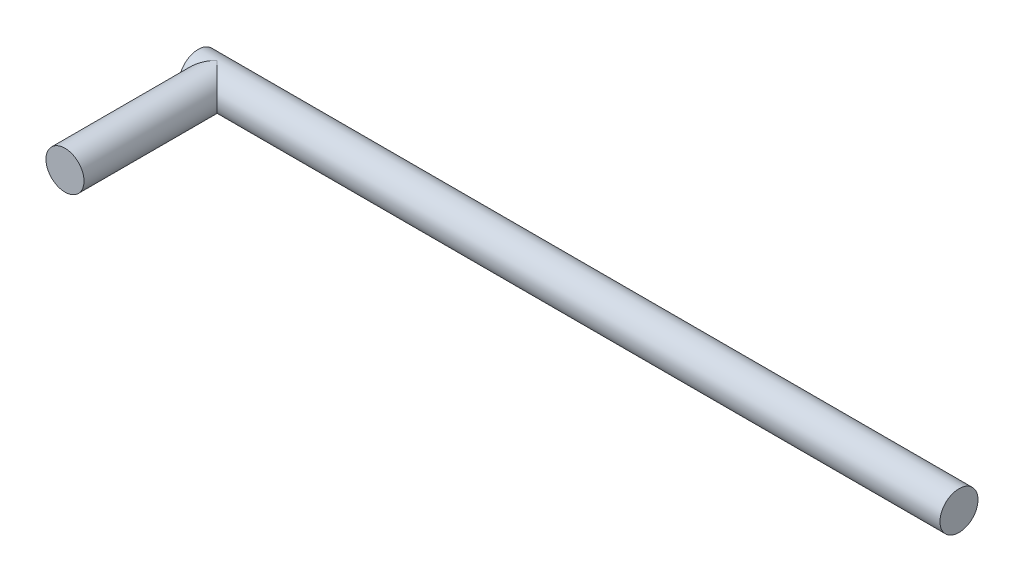
ISO-10303-21;
HEADER;
FILE_DESCRIPTION(('STEP AP214'),'2;1');
FILE_NAME('part.step','',(''),(''),'','','');
FILE_SCHEMA(('AUTOMOTIVE_DESIGN { 1 0 10303 214 1 1 1 1 }'));
ENDSEC;
DATA;
#1=APPLICATION_CONTEXT('core data for automotive mechanical design processes');
#2=APPLICATION_PROTOCOL_DEFINITION('international standard','automotive_design',2000,#1);
#3=PRODUCT_CONTEXT('',#1,'mechanical');
#4=PRODUCT('Part','Part','',(#3));
#5=PRODUCT_RELATED_PRODUCT_CATEGORY('part','',(#4));
#6=PRODUCT_DEFINITION_FORMATION('','',#4);
#7=PRODUCT_DEFINITION_CONTEXT('part definition',#1,'design');
#8=PRODUCT_DEFINITION('design','',#6,#7);
#9=PRODUCT_DEFINITION_SHAPE('','',#8);
#10=(LENGTH_UNIT() NAMED_UNIT(*) SI_UNIT(.MILLI.,.METRE.));
#11=(NAMED_UNIT(*) PLANE_ANGLE_UNIT() SI_UNIT($,.RADIAN.));
#12=(NAMED_UNIT(*) SI_UNIT($,.STERADIAN.) SOLID_ANGLE_UNIT());
#13=UNCERTAINTY_MEASURE_WITH_UNIT(LENGTH_MEASURE(1.E-05),#10,'distance_accuracy_value','');
#14=(GEOMETRIC_REPRESENTATION_CONTEXT(3) GLOBAL_UNCERTAINTY_ASSIGNED_CONTEXT((#13)) GLOBAL_UNIT_ASSIGNED_CONTEXT((#10,
#11,#12)) REPRESENTATION_CONTEXT('',''));
#15=CARTESIAN_POINT('',(0.,0.,0.));
#16=DIRECTION('',(0.,0.,1.));
#17=DIRECTION('',(1.,0.,0.));
#18=AXIS2_PLACEMENT_3D('',#15,#16,#17);
#19=CARTESIAN_POINT('',(50.8,0.,0.));
#20=DIRECTION('',(-1.,0.,0.));
#21=DIRECTION('',(0.,0.,1.));
#22=AXIS2_PLACEMENT_3D('',#19,#20,#21);
#23=CYLINDRICAL_SURFACE('',#22,1.27);
#24=CARTESIAN_POINT('',(50.8,0.,0.));
#25=DIRECTION('',(1.,0.,0.));
#26=DIRECTION('',(0.,0.,-1.));
#27=AXIS2_PLACEMENT_3D('',#24,#25,#26);
#28=CIRCLE('',#27,1.27);
#29=CARTESIAN_POINT('',(50.8,0.,-1.27));
#30=VERTEX_POINT('',#29);
#31=EDGE_CURVE('E11',#30,#30,#28,.T.);
#32=ORIENTED_EDGE('',*,*,#31,.F.);
#33=EDGE_LOOP('',(#32));
#34=FACE_BOUND('',#33,.T.);
#35=CARTESIAN_POINT('',(1.27,0.,0.));
#36=DIRECTION('',(-0.707106781186547,0.,-0.707106781186547));
#37=DIRECTION('',(-0.707106781186547,0.,0.707106781186547));
#38=AXIS2_PLACEMENT_3D('',#35,#36,#37);
#39=ELLIPSE('',#38,1.79605122421383,1.27);
#40=CARTESIAN_POINT('',(1.27,1.27,0.));
#41=VERTEX_POINT('',#40);
#42=CARTESIAN_POINT('',(0.,0.,1.27));
#43=VERTEX_POINT('',#42);
#44=EDGE_CURVE('E54',#41,#43,#39,.F.);
#45=ORIENTED_EDGE('',*,*,#44,.F.);
#46=CARTESIAN_POINT('',(1.27,0.,0.));
#47=DIRECTION('',(-0.707106781186547,0.,0.707106781186547));
#48=DIRECTION('',(-0.707106781186547,0.,-0.707106781186547));
#49=AXIS2_PLACEMENT_3D('',#46,#47,#48);
#50=ELLIPSE('',#49,1.79605122421383,1.27);
#51=CARTESIAN_POINT('',(1.27,-1.27,0.));
#52=VERTEX_POINT('',#51);
#53=EDGE_CURVE('E47',#52,#41,#50,.T.);
#54=ORIENTED_EDGE('',*,*,#53,.F.);
#55=EDGE_CURVE('E51',#43,#52,#39,.F.);
#56=ORIENTED_EDGE('',*,*,#55,.F.);
#57=CARTESIAN_POINT('',(0.,0.,0.));
#58=DIRECTION('',(1.,0.,0.));
#59=DIRECTION('',(0.,0.,-1.));
#60=AXIS2_PLACEMENT_3D('',#57,#58,#59);
#61=CIRCLE('',#60,1.27);
#62=EDGE_CURVE('E36',#43,#43,#61,.T.);
#63=ORIENTED_EDGE('',*,*,#62,.T.);
#64=EDGE_LOOP('',(#45,#54,#56,#63));
#65=FACE_BOUND('',#64,.T.);
#66=ADVANCED_FACE('F33',(#34,#65),#23,.T.);
#67=CARTESIAN_POINT('',(50.8,0.,0.));
#68=DIRECTION('',(1.,0.,0.));
#69=DIRECTION('',(0.,0.,-1.));
#70=AXIS2_PLACEMENT_3D('',#67,#68,#69);
#71=PLANE('',#70);
#72=ORIENTED_EDGE('',*,*,#31,.T.);
#73=EDGE_LOOP('',(#72));
#74=FACE_BOUND('',#73,.T.);
#75=ADVANCED_FACE('F75',(#74),#71,.T.);
#76=CARTESIAN_POINT('',(0.,0.,0.));
#77=DIRECTION('',(1.,0.,0.));
#78=DIRECTION('',(0.,0.,-1.));
#79=AXIS2_PLACEMENT_3D('',#76,#77,#78);
#80=PLANE('',#79);
#81=ORIENTED_EDGE('',*,*,#62,.F.);
#82=EDGE_LOOP('',(#81));
#83=FACE_BOUND('',#82,.T.);
#84=ADVANCED_FACE('F68',(#83),#80,.F.);
#85=CARTESIAN_POINT('',(1.27,0.,10.16));
#86=DIRECTION('',(0.,0.,-1.));
#87=DIRECTION('',(-1.,0.,0.));
#88=AXIS2_PLACEMENT_3D('',#85,#86,#87);
#89=CYLINDRICAL_SURFACE('',#88,1.27);
#90=CARTESIAN_POINT('',(1.27,0.,10.16));
#91=DIRECTION('',(0.,0.,1.));
#92=DIRECTION('',(1.,0.,0.));
#93=AXIS2_PLACEMENT_3D('',#90,#91,#92);
#94=CIRCLE('',#93,1.27);
#95=CARTESIAN_POINT('',(2.54,0.,10.16));
#96=VERTEX_POINT('',#95);
#97=EDGE_CURVE('E60',#96,#96,#94,.T.);
#98=ORIENTED_EDGE('',*,*,#97,.F.);
#99=EDGE_LOOP('',(#98));
#100=FACE_BOUND('',#99,.T.);
#101=ORIENTED_EDGE('',*,*,#53,.T.);
#102=ORIENTED_EDGE('',*,*,#44,.T.);
#103=ORIENTED_EDGE('',*,*,#55,.T.);
#104=EDGE_LOOP('',(#101,#102,#103));
#105=FACE_BOUND('',#104,.T.);
#106=ADVANCED_FACE('F58',(#100,#105),#89,.T.);
#107=CARTESIAN_POINT('',(1.27,0.,10.16));
#108=DIRECTION('',(0.,0.,1.));
#109=DIRECTION('',(1.,0.,0.));
#110=AXIS2_PLACEMENT_3D('',#107,#108,#109);
#111=PLANE('',#110);
#112=ORIENTED_EDGE('',*,*,#97,.T.);
#113=EDGE_LOOP('',(#112));
#114=FACE_BOUND('',#113,.T.);
#115=ADVANCED_FACE('F65',(#114),#111,.T.);
#116=CLOSED_SHELL('',(#66,#75,#84,#106,#115));
#117=MANIFOLD_SOLID_BREP('B2',#116);
#118=ADVANCED_BREP_SHAPE_REPRESENTATION('',(#18,#117),#14);
#119=SHAPE_DEFINITION_REPRESENTATION(#9,#118);
ENDSEC;
END-ISO-10303-21;
